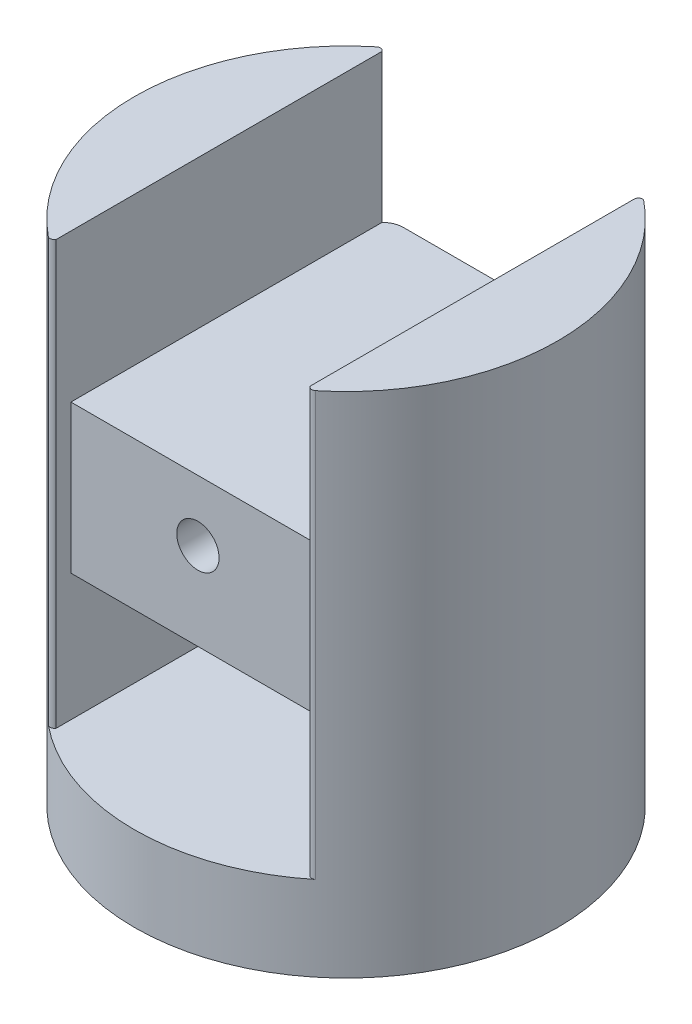
ISO-10303-21;
HEADER;
FILE_DESCRIPTION(('STEP AP214'),'2;1');
FILE_NAME('part.step','',(''),(''),'','','');
FILE_SCHEMA(('AUTOMOTIVE_DESIGN { 1 0 10303 214 1 1 1 1 }'));
ENDSEC;
DATA;
#1=APPLICATION_CONTEXT('core data for automotive mechanical design processes');
#2=APPLICATION_PROTOCOL_DEFINITION('international standard','automotive_design',2000,#1);
#3=PRODUCT_CONTEXT('',#1,'mechanical');
#4=PRODUCT('Part','Part','',(#3));
#5=PRODUCT_RELATED_PRODUCT_CATEGORY('part','',(#4));
#6=PRODUCT_DEFINITION_FORMATION('','',#4);
#7=PRODUCT_DEFINITION_CONTEXT('part definition',#1,'design');
#8=PRODUCT_DEFINITION('design','',#6,#7);
#9=PRODUCT_DEFINITION_SHAPE('','',#8);
#10=(LENGTH_UNIT() NAMED_UNIT(*) SI_UNIT(.MILLI.,.METRE.));
#11=(NAMED_UNIT(*) PLANE_ANGLE_UNIT() SI_UNIT($,.RADIAN.));
#12=(NAMED_UNIT(*) SI_UNIT($,.STERADIAN.) SOLID_ANGLE_UNIT());
#13=UNCERTAINTY_MEASURE_WITH_UNIT(LENGTH_MEASURE(1.E-05),#10,'distance_accuracy_value','');
#14=(GEOMETRIC_REPRESENTATION_CONTEXT(3) GLOBAL_UNCERTAINTY_ASSIGNED_CONTEXT((#13)) GLOBAL_UNIT_ASSIGNED_CONTEXT((#10,
#11,#12)) REPRESENTATION_CONTEXT('',''));
#15=CARTESIAN_POINT('',(0.,0.,0.));
#16=DIRECTION('',(0.,0.,1.));
#17=DIRECTION('',(1.,0.,0.));
#18=AXIS2_PLACEMENT_3D('',#15,#16,#17);
#19=CARTESIAN_POINT('',(-6.,24.,-7.7));
#20=DIRECTION('',(-1.,0.,0.));
#21=DIRECTION('',(0.,0.,1.));
#22=AXIS2_PLACEMENT_3D('',#19,#20,#21);
#23=PLANE('',#22);
#24=DIRECTION('',(0.,0.,-1.));
#25=VECTOR('',#24,1.);
#26=CARTESIAN_POINT('',(-6.,10.,7.));
#27=LINE('',#26,#25);
#28=CARTESIAN_POINT('',(-6.,10.,7.));
#29=VERTEX_POINT('',#28);
#30=CARTESIAN_POINT('',(-6.,10.,-7.69999999999999));
#31=VERTEX_POINT('',#30);
#32=EDGE_CURVE('E341',#29,#31,#27,.T.);
#33=ORIENTED_EDGE('',*,*,#32,.F.);
#34=DIRECTION('',(0.,-1.,0.));
#35=VECTOR('',#34,1.);
#36=CARTESIAN_POINT('',(-6.,17.,7.));
#37=LINE('',#36,#35);
#38=CARTESIAN_POINT('',(-6.,17.,7.));
#39=VERTEX_POINT('',#38);
#40=EDGE_CURVE('E154',#39,#29,#37,.T.);
#41=ORIENTED_EDGE('',*,*,#40,.F.);
#42=DIRECTION('',(0.,0.,1.));
#43=VECTOR('',#42,1.);
#44=CARTESIAN_POINT('',(-6.,17.,7.));
#45=LINE('',#44,#43);
#46=CARTESIAN_POINT('',(-6.,17.,-7.7));
#47=VERTEX_POINT('',#46);
#48=EDGE_CURVE('E171',#47,#39,#45,.T.);
#49=ORIENTED_EDGE('',*,*,#48,.F.);
#50=DIRECTION('',(0.,-1.,0.));
#51=VECTOR('',#50,1.);
#52=CARTESIAN_POINT('',(-6.,24.,-7.7));
#53=LINE('',#52,#51);
#54=CARTESIAN_POINT('',(-6.,24.,-7.7));
#55=VERTEX_POINT('',#54);
#56=EDGE_CURVE('E228',#55,#47,#53,.T.);
#57=ORIENTED_EDGE('',*,*,#56,.F.);
#58=DIRECTION('',(0.,0.,-1.));
#59=VECTOR('',#58,1.);
#60=CARTESIAN_POINT('',(-6.,24.,-7.7));
#61=LINE('',#60,#59);
#62=CARTESIAN_POINT('',(-6.,24.,7.7));
#63=VERTEX_POINT('',#62);
#64=EDGE_CURVE('E218',#63,#55,#61,.T.);
#65=ORIENTED_EDGE('',*,*,#64,.F.);
#66=DIRECTION('',(0.,-1.,0.));
#67=VECTOR('',#66,1.);
#68=CARTESIAN_POINT('',(-6.,24.,7.7));
#69=LINE('',#68,#67);
#70=CARTESIAN_POINT('',(-6.,4.,7.7));
#71=VERTEX_POINT('',#70);
#72=EDGE_CURVE('E231',#63,#71,#69,.T.);
#73=ORIENTED_EDGE('',*,*,#72,.T.);
#74=DIRECTION('',(0.,0.,-1.));
#75=VECTOR('',#74,1.);
#76=CARTESIAN_POINT('',(-6.,4.,-7.7));
#77=LINE('',#76,#75);
#78=CARTESIAN_POINT('',(-6.,4.,-7.7));
#79=VERTEX_POINT('',#78);
#80=EDGE_CURVE('E214',#71,#79,#77,.T.);
#81=ORIENTED_EDGE('',*,*,#80,.T.);
#82=EDGE_CURVE('E220',#31,#79,#53,.T.);
#83=ORIENTED_EDGE('',*,*,#82,.F.);
#84=EDGE_LOOP('',(#33,#41,#49,#57,#65,#73,#81,#83));
#85=FACE_BOUND('',#84,.T.);
#86=ADVANCED_FACE('F37',(#85),#23,.F.);
#87=CARTESIAN_POINT('',(6.21370462181772,24.,-7.60398190115382));
#88=DIRECTION('',(0.,-1.,0.));
#89=DIRECTION('',(0.,0.,-1.));
#90=AXIS2_PLACEMENT_3D('',#87,#88,#89);
#91=CYLINDRICAL_SURFACE('',#90,0.213741715448937);
#92=CARTESIAN_POINT('',(6.21370462181772,10.,-7.60398190115382));
#93=DIRECTION('',(0.,-1.,0.));
#94=DIRECTION('',(0.,0.,-1.));
#95=AXIS2_PLACEMENT_3D('',#92,#93,#94);
#96=CIRCLE('',#95,0.213741715448937);
#97=CARTESIAN_POINT('',(6.,10.,-7.60796380230771));
#98=VERTEX_POINT('',#97);
#99=CARTESIAN_POINT('',(6.,10.,-7.59999999999996));
#100=VERTEX_POINT('',#99);
#101=EDGE_CURVE('E165',#98,#100,#96,.F.);
#102=ORIENTED_EDGE('',*,*,#101,.F.);
#103=DIRECTION('',(0.,-1.,0.));
#104=VECTOR('',#103,1.);
#105=CARTESIAN_POINT('',(6.,24.,-7.60796380230762));
#106=LINE('',#105,#104);
#107=CARTESIAN_POINT('',(6.,17.,-7.60796380230762));
#108=VERTEX_POINT('',#107);
#109=EDGE_CURVE('E245',#108,#98,#106,.T.);
#110=ORIENTED_EDGE('',*,*,#109,.F.);
#111=CARTESIAN_POINT('',(6.21370462181772,17.,-7.60398190115382));
#112=DIRECTION('',(0.,-1.,0.));
#113=DIRECTION('',(0.,0.,-1.));
#114=AXIS2_PLACEMENT_3D('',#111,#112,#113);
#115=CIRCLE('',#114,0.213741715448937);
#116=CARTESIAN_POINT('',(6.,17.,-7.60000000000001));
#117=VERTEX_POINT('',#116);
#118=EDGE_CURVE('E181',#117,#108,#115,.T.);
#119=ORIENTED_EDGE('',*,*,#118,.F.);
#120=DIRECTION('',(0.,-1.,0.));
#121=VECTOR('',#120,1.);
#122=CARTESIAN_POINT('',(6.,24.,-7.6));
#123=LINE('',#122,#121);
#124=CARTESIAN_POINT('',(6.,24.,-7.6));
#125=VERTEX_POINT('',#124);
#126=EDGE_CURVE('E203',#125,#117,#123,.T.);
#127=ORIENTED_EDGE('',*,*,#126,.F.);
#128=CARTESIAN_POINT('',(6.21370462181772,24.,-7.60398190115382));
#129=DIRECTION('',(0.,1.,0.));
#130=DIRECTION('',(0.,0.,-1.));
#131=AXIS2_PLACEMENT_3D('',#128,#129,#130);
#132=CIRCLE('',#131,0.213741715448937);
#133=CARTESIAN_POINT('',(6.23727299848108,24.,-7.81642025113919));
#134=VERTEX_POINT('',#133);
#135=EDGE_CURVE('E188',#134,#125,#132,.T.);
#136=ORIENTED_EDGE('',*,*,#135,.F.);
#137=DIRECTION('',(0.,-1.,0.));
#138=VECTOR('',#137,1.);
#139=CARTESIAN_POINT('',(6.23727299848108,24.,-7.81642025113919));
#140=LINE('',#139,#138);
#141=CARTESIAN_POINT('',(6.23727299848108,4.,-7.81642025113919));
#142=VERTEX_POINT('',#141);
#143=EDGE_CURVE('E205',#134,#142,#140,.T.);
#144=ORIENTED_EDGE('',*,*,#143,.T.);
#145=CARTESIAN_POINT('',(6.21370462181772,4.,-7.60398190115382));
#146=DIRECTION('',(0.,1.,0.));
#147=DIRECTION('',(0.,0.,-1.));
#148=AXIS2_PLACEMENT_3D('',#145,#146,#147);
#149=CIRCLE('',#148,0.213741715448937);
#150=CARTESIAN_POINT('',(6.,4.,-7.6));
#151=VERTEX_POINT('',#150);
#152=EDGE_CURVE('E196',#142,#151,#149,.T.);
#153=ORIENTED_EDGE('',*,*,#152,.T.);
#154=EDGE_CURVE('E202',#100,#151,#123,.T.);
#155=ORIENTED_EDGE('',*,*,#154,.F.);
#156=EDGE_LOOP('',(#102,#110,#119,#127,#136,#144,#153,#155));
#157=FACE_BOUND('',#156,.T.);
#158=ADVANCED_FACE('F299',(#157),#91,.T.);
#159=CARTESIAN_POINT('',(6.,24.,-7.6));
#160=DIRECTION('',(1.,0.,0.));
#161=DIRECTION('',(0.,0.,-1.));
#162=AXIS2_PLACEMENT_3D('',#159,#160,#161);
#163=PLANE('',#162);
#164=DIRECTION('',(0.,-1.,0.));
#165=VECTOR('',#164,1.);
#166=CARTESIAN_POINT('',(6.,17.,7.));
#167=LINE('',#166,#165);
#168=CARTESIAN_POINT('',(6.,17.,7.));
#169=VERTEX_POINT('',#168);
#170=CARTESIAN_POINT('',(6.,10.,7.));
#171=VERTEX_POINT('',#170);
#172=EDGE_CURVE('E144',#169,#171,#167,.T.);
#173=ORIENTED_EDGE('',*,*,#172,.T.);
#174=DIRECTION('',(0.,0.,1.));
#175=VECTOR('',#174,1.);
#176=CARTESIAN_POINT('',(6.,10.,7.));
#177=LINE('',#176,#175);
#178=EDGE_CURVE('E147',#100,#171,#177,.T.);
#179=ORIENTED_EDGE('',*,*,#178,.F.);
#180=ORIENTED_EDGE('',*,*,#154,.T.);
#181=DIRECTION('',(0.,0.,1.));
#182=VECTOR('',#181,1.);
#183=CARTESIAN_POINT('',(6.,4.,-7.6));
#184=LINE('',#183,#182);
#185=CARTESIAN_POINT('',(6.,4.,7.7));
#186=VERTEX_POINT('',#185);
#187=EDGE_CURVE('E186',#151,#186,#184,.T.);
#188=ORIENTED_EDGE('',*,*,#187,.T.);
#189=DIRECTION('',(0.,-1.,0.));
#190=VECTOR('',#189,1.);
#191=CARTESIAN_POINT('',(6.,24.,7.7));
#192=LINE('',#191,#190);
#193=CARTESIAN_POINT('',(6.,24.,7.7));
#194=VERTEX_POINT('',#193);
#195=EDGE_CURVE('E192',#194,#186,#192,.T.);
#196=ORIENTED_EDGE('',*,*,#195,.F.);
#197=DIRECTION('',(0.,0.,1.));
#198=VECTOR('',#197,1.);
#199=CARTESIAN_POINT('',(6.,24.,-7.6));
#200=LINE('',#199,#198);
#201=EDGE_CURVE('E190',#125,#194,#200,.T.);
#202=ORIENTED_EDGE('',*,*,#201,.F.);
#203=ORIENTED_EDGE('',*,*,#126,.T.);
#204=DIRECTION('',(0.,0.,-1.));
#205=VECTOR('',#204,1.);
#206=CARTESIAN_POINT('',(6.,17.,-8.));
#207=LINE('',#206,#205);
#208=EDGE_CURVE('E150',#169,#117,#207,.T.);
#209=ORIENTED_EDGE('',*,*,#208,.F.);
#210=EDGE_LOOP('',(#173,#179,#180,#188,#196,#202,#203,#209));
#211=FACE_BOUND('',#210,.T.);
#212=ADVANCED_FACE('F146',(#211),#163,.F.);
#213=CARTESIAN_POINT('',(0.,4.,0.));
#214=DIRECTION('',(0.,1.,0.));
#215=DIRECTION('',(0.,0.,1.));
#216=AXIS2_PLACEMENT_3D('',#213,#214,#215);
#217=PLANE('',#216);
#218=CARTESIAN_POINT('',(0.,4.,0.));
#219=DIRECTION('',(0.,1.,0.));
#220=DIRECTION('',(0.,0.,1.));
#221=AXIS2_PLACEMENT_3D('',#218,#219,#220);
#222=CIRCLE('',#221,10.);
#223=CARTESIAN_POINT('',(-6.31513599359872,4.,7.75364800480096));
#224=VERTEX_POINT('',#223);
#225=CARTESIAN_POINT('',(6.31513599359872,4.,7.75364800480096));
#226=VERTEX_POINT('',#225);
#227=EDGE_CURVE('E242',#224,#226,#222,.T.);
#228=ORIENTED_EDGE('',*,*,#227,.T.);
#229=CARTESIAN_POINT('',(6.18118610563427,4.,7.58808787936614));
#230=DIRECTION('',(0.,1.,0.));
#231=DIRECTION('',(0.,0.,1.));
#232=AXIS2_PLACEMENT_3D('',#229,#230,#231);
#233=CIRCLE('',#232,0.212961798498422);
#234=EDGE_CURVE('E193',#186,#226,#233,.T.);
#235=ORIENTED_EDGE('',*,*,#234,.F.);
#236=ORIENTED_EDGE('',*,*,#187,.F.);
#237=ORIENTED_EDGE('',*,*,#152,.F.);
#238=CARTESIAN_POINT('',(-6.31513599359872,4.,-7.75364800480096));
#239=VERTEX_POINT('',#238);
#240=EDGE_CURVE('E246',#142,#239,#222,.T.);
#241=ORIENTED_EDGE('',*,*,#240,.T.);
#242=CARTESIAN_POINT('',(-6.18118610563427,4.,-7.58808787936614));
#243=DIRECTION('',(0.,1.,0.));
#244=DIRECTION('',(0.,0.,1.));
#245=AXIS2_PLACEMENT_3D('',#242,#243,#244);
#246=CIRCLE('',#245,0.212961798498421);
#247=EDGE_CURVE('E209',#79,#239,#246,.T.);
#248=ORIENTED_EDGE('',*,*,#247,.F.);
#249=ORIENTED_EDGE('',*,*,#80,.F.);
#250=CARTESIAN_POINT('',(-6.18118610563427,4.,7.58808787936614));
#251=DIRECTION('',(0.,1.,0.));
#252=DIRECTION('',(0.,0.,-1.));
#253=AXIS2_PLACEMENT_3D('',#250,#251,#252);
#254=CIRCLE('',#253,0.212961798498423);
#255=EDGE_CURVE('E223',#224,#71,#254,.T.);
#256=ORIENTED_EDGE('',*,*,#255,.F.);
#257=EDGE_LOOP('',(#228,#235,#236,#237,#241,#248,#249,#256));
#258=FACE_BOUND('',#257,.T.);
#259=ADVANCED_FACE('F277',(#258),#217,.T.);
#260=CARTESIAN_POINT('',(0.,4.,0.));
#261=DIRECTION('',(0.,-1.,0.));
#262=DIRECTION('',(0.,0.,-1.));
#263=AXIS2_PLACEMENT_3D('',#260,#261,#262);
#264=CYLINDRICAL_SURFACE('',#263,10.);
#265=ORIENTED_EDGE('',*,*,#227,.F.);
#266=DIRECTION('',(0.,-1.,0.));
#267=VECTOR('',#266,1.);
#268=CARTESIAN_POINT('',(-6.31513599359872,24.,7.75364800480096));
#269=LINE('',#268,#267);
#270=CARTESIAN_POINT('',(-6.31513599359872,24.,7.75364800480096));
#271=VERTEX_POINT('',#270);
#272=EDGE_CURVE('E235',#271,#224,#269,.T.);
#273=ORIENTED_EDGE('',*,*,#272,.F.);
#274=CARTESIAN_POINT('',(0.,24.,0.));
#275=DIRECTION('',(0.,1.,0.));
#276=DIRECTION('',(0.,0.,1.));
#277=AXIS2_PLACEMENT_3D('',#274,#275,#276);
#278=CIRCLE('',#277,10.);
#279=CARTESIAN_POINT('',(-6.31513599359872,24.,-7.75364800480096));
#280=VERTEX_POINT('',#279);
#281=EDGE_CURVE('E213',#280,#271,#278,.T.);
#282=ORIENTED_EDGE('',*,*,#281,.F.);
#283=DIRECTION('',(0.,-1.,0.));
#284=VECTOR('',#283,1.);
#285=CARTESIAN_POINT('',(-6.31513599359872,24.,-7.75364800480096));
#286=LINE('',#285,#284);
#287=EDGE_CURVE('E238',#280,#239,#286,.T.);
#288=ORIENTED_EDGE('',*,*,#287,.T.);
#289=ORIENTED_EDGE('',*,*,#240,.F.);
#290=ORIENTED_EDGE('',*,*,#143,.F.);
#291=CARTESIAN_POINT('',(0.,24.,0.));
#292=DIRECTION('',(0.,1.,0.));
#293=DIRECTION('',(0.,0.,1.));
#294=AXIS2_PLACEMENT_3D('',#291,#292,#293);
#295=CIRCLE('',#294,10.);
#296=CARTESIAN_POINT('',(6.31513599359872,24.,7.75364800480096));
#297=VERTEX_POINT('',#296);
#298=EDGE_CURVE('E185',#297,#134,#295,.T.);
#299=ORIENTED_EDGE('',*,*,#298,.F.);
#300=DIRECTION('',(0.,-1.,0.));
#301=VECTOR('',#300,1.);
#302=CARTESIAN_POINT('',(6.31513599359872,24.,7.75364800480096));
#303=LINE('',#302,#301);
#304=EDGE_CURVE('E207',#297,#226,#303,.T.);
#305=ORIENTED_EDGE('',*,*,#304,.T.);
#306=EDGE_LOOP('',(#265,#273,#282,#288,#289,#290,#299,#305));
#307=FACE_BOUND('',#306,.T.);
#308=CARTESIAN_POINT('',(0.,0.,0.));
#309=DIRECTION('',(0.,1.,0.));
#310=DIRECTION('',(0.,0.,1.));
#311=AXIS2_PLACEMENT_3D('',#308,#309,#310);
#312=CIRCLE('',#311,10.);
#313=CARTESIAN_POINT('',(0.,0.,10.));
#314=VERTEX_POINT('',#313);
#315=EDGE_CURVE('E241',#314,#314,#312,.T.);
#316=ORIENTED_EDGE('',*,*,#315,.T.);
#317=EDGE_LOOP('',(#316));
#318=FACE_BOUND('',#317,.T.);
#319=ADVANCED_FACE('F288',(#307,#318),#264,.T.);
#320=CARTESIAN_POINT('',(0.,0.,0.));
#321=DIRECTION('',(0.,1.,0.));
#322=DIRECTION('',(0.,0.,1.));
#323=AXIS2_PLACEMENT_3D('',#320,#321,#322);
#324=PLANE('',#323);
#325=ORIENTED_EDGE('',*,*,#315,.F.);
#326=EDGE_LOOP('',(#325));
#327=FACE_BOUND('',#326,.T.);
#328=ADVANCED_FACE('F322',(#327),#324,.F.);
#329=CARTESIAN_POINT('',(-6.18118610563427,24.,-7.58808787936614));
#330=DIRECTION('',(0.,-1.,0.));
#331=DIRECTION('',(0.,0.,-1.));
#332=AXIS2_PLACEMENT_3D('',#329,#330,#331);
#333=CYLINDRICAL_SURFACE('',#332,0.212961798498421);
#334=ORIENTED_EDGE('',*,*,#247,.T.);
#335=ORIENTED_EDGE('',*,*,#287,.F.);
#336=CARTESIAN_POINT('',(-6.18118610563427,24.,-7.58808787936614));
#337=DIRECTION('',(0.,1.,0.));
#338=DIRECTION('',(0.,0.,1.));
#339=AXIS2_PLACEMENT_3D('',#336,#337,#338);
#340=CIRCLE('',#339,0.212961798498421);
#341=EDGE_CURVE('E210',#55,#280,#340,.T.);
#342=ORIENTED_EDGE('',*,*,#341,.F.);
#343=ORIENTED_EDGE('',*,*,#56,.T.);
#344=EDGE_CURVE('E232',#47,#31,#53,.T.);
#345=ORIENTED_EDGE('',*,*,#344,.T.);
#346=ORIENTED_EDGE('',*,*,#82,.T.);
#347=EDGE_LOOP('',(#334,#335,#342,#343,#345,#346));
#348=FACE_BOUND('',#347,.T.);
#349=ADVANCED_FACE('F272',(#348),#333,.T.);
#350=CARTESIAN_POINT('',(-6.18118610563427,24.,7.58808787936614));
#351=DIRECTION('',(0.,-1.,0.));
#352=DIRECTION('',(0.,0.,-1.));
#353=AXIS2_PLACEMENT_3D('',#350,#351,#352);
#354=CYLINDRICAL_SURFACE('',#353,0.212961798498423);
#355=ORIENTED_EDGE('',*,*,#255,.T.);
#356=ORIENTED_EDGE('',*,*,#72,.F.);
#357=CARTESIAN_POINT('',(-6.18118610563427,24.,7.58808787936614));
#358=DIRECTION('',(0.,1.,0.));
#359=DIRECTION('',(0.,0.,-1.));
#360=AXIS2_PLACEMENT_3D('',#357,#358,#359);
#361=CIRCLE('',#360,0.212961798498423);
#362=EDGE_CURVE('E216',#271,#63,#361,.T.);
#363=ORIENTED_EDGE('',*,*,#362,.F.);
#364=ORIENTED_EDGE('',*,*,#272,.T.);
#365=EDGE_LOOP('',(#355,#356,#363,#364));
#366=FACE_BOUND('',#365,.T.);
#367=ADVANCED_FACE('F283',(#366),#354,.T.);
#368=CARTESIAN_POINT('',(-6.18118610563427,24.,-7.58808787936614));
#369=DIRECTION('',(0.,1.,0.));
#370=DIRECTION('',(0.,0.,1.));
#371=AXIS2_PLACEMENT_3D('',#368,#369,#370);
#372=PLANE('',#371);
#373=ORIENTED_EDGE('',*,*,#341,.T.);
#374=ORIENTED_EDGE('',*,*,#281,.T.);
#375=ORIENTED_EDGE('',*,*,#362,.T.);
#376=ORIENTED_EDGE('',*,*,#64,.T.);
#377=EDGE_LOOP('',(#373,#374,#375,#376));
#378=FACE_BOUND('',#377,.T.);
#379=ADVANCED_FACE('F303',(#378),#372,.T.);
#380=CARTESIAN_POINT('',(6.18118610563427,24.,7.58808787936614));
#381=DIRECTION('',(0.,-1.,0.));
#382=DIRECTION('',(0.,0.,-1.));
#383=AXIS2_PLACEMENT_3D('',#380,#381,#382);
#384=CYLINDRICAL_SURFACE('',#383,0.212961798498422);
#385=ORIENTED_EDGE('',*,*,#234,.T.);
#386=ORIENTED_EDGE('',*,*,#304,.F.);
#387=CARTESIAN_POINT('',(6.18118610563427,24.,7.58808787936614));
#388=DIRECTION('',(0.,1.,0.));
#389=DIRECTION('',(0.,0.,1.));
#390=AXIS2_PLACEMENT_3D('',#387,#388,#389);
#391=CIRCLE('',#390,0.212961798498422);
#392=EDGE_CURVE('E182',#194,#297,#391,.T.);
#393=ORIENTED_EDGE('',*,*,#392,.F.);
#394=ORIENTED_EDGE('',*,*,#195,.T.);
#395=EDGE_LOOP('',(#385,#386,#393,#394));
#396=FACE_BOUND('',#395,.T.);
#397=ADVANCED_FACE('F294',(#396),#384,.T.);
#398=CARTESIAN_POINT('',(6.18118610563427,24.,7.58808787936614));
#399=DIRECTION('',(0.,1.,0.));
#400=DIRECTION('',(0.,0.,1.));
#401=AXIS2_PLACEMENT_3D('',#398,#399,#400);
#402=PLANE('',#401);
#403=ORIENTED_EDGE('',*,*,#392,.T.);
#404=ORIENTED_EDGE('',*,*,#298,.T.);
#405=ORIENTED_EDGE('',*,*,#135,.T.);
#406=ORIENTED_EDGE('',*,*,#201,.T.);
#407=EDGE_LOOP('',(#403,#404,#405,#406));
#408=FACE_BOUND('',#407,.T.);
#409=ADVANCED_FACE('F310',(#408),#402,.T.);
#410=CARTESIAN_POINT('',(0.,17.,0.));
#411=DIRECTION('',(0.,-1.,0.));
#412=DIRECTION('',(0.,0.,-1.));
#413=AXIS2_PLACEMENT_3D('',#410,#411,#412);
#414=PLANE('',#413);
#415=ORIENTED_EDGE('',*,*,#118,.T.);
#416=CARTESIAN_POINT('',(5.20603525576783,17.,-7.));
#417=DIRECTION('',(0.,-1.,0.));
#418=DIRECTION('',(0.,0.,-1.));
#419=AXIS2_PLACEMENT_3D('',#416,#417,#418);
#420=CIRCLE('',#419,1.);
#421=CARTESIAN_POINT('',(5.20603525576783,17.,-8.));
#422=VERTEX_POINT('',#421);
#423=EDGE_CURVE('E11',#108,#422,#420,.F.);
#424=ORIENTED_EDGE('',*,*,#423,.T.);
#425=DIRECTION('',(-1.,0.,0.));
#426=VECTOR('',#425,1.);
#427=CARTESIAN_POINT('',(-6.,17.,-8.));
#428=LINE('',#427,#426);
#429=CARTESIAN_POINT('',(-5.28585715714571,17.,-8.));
#430=VERTEX_POINT('',#429);
#431=EDGE_CURVE('E155',#422,#430,#428,.T.);
#432=ORIENTED_EDGE('',*,*,#431,.T.);
#433=CARTESIAN_POINT('',(-5.28585715714571,17.,-7.));
#434=DIRECTION('',(0.,-1.,0.));
#435=DIRECTION('',(0.,0.,-1.));
#436=AXIS2_PLACEMENT_3D('',#433,#434,#435);
#437=CIRCLE('',#436,1.);
#438=EDGE_CURVE('E45',#430,#47,#437,.F.);
#439=ORIENTED_EDGE('',*,*,#438,.T.);
#440=ORIENTED_EDGE('',*,*,#48,.T.);
#441=DIRECTION('',(1.,0.,0.));
#442=VECTOR('',#441,1.);
#443=CARTESIAN_POINT('',(6.,17.,7.));
#444=LINE('',#443,#442);
#445=EDGE_CURVE('E176',#39,#169,#444,.T.);
#446=ORIENTED_EDGE('',*,*,#445,.T.);
#447=ORIENTED_EDGE('',*,*,#208,.T.);
#448=EDGE_LOOP('',(#415,#424,#432,#439,#440,#446,#447));
#449=FACE_BOUND('',#448,.T.);
#450=ADVANCED_FACE('F263',(#449),#414,.F.);
#451=CARTESIAN_POINT('',(6.,17.,7.));
#452=DIRECTION('',(0.,0.,-1.));
#453=DIRECTION('',(-1.,0.,0.));
#454=AXIS2_PLACEMENT_3D('',#451,#452,#453);
#455=PLANE('',#454);
#456=CARTESIAN_POINT('',(0.,14.12,7.));
#457=DIRECTION('',(0.,0.,1.));
#458=DIRECTION('',(-1.,0.,0.));
#459=AXIS2_PLACEMENT_3D('',#456,#457,#458);
#460=CIRCLE('',#459,1.);
#461=CARTESIAN_POINT('',(-0.999999999999999,14.12,7.));
#462=VERTEX_POINT('',#461);
#463=EDGE_CURVE('E347',#462,#462,#460,.T.);
#464=ORIENTED_EDGE('',*,*,#463,.F.);
#465=EDGE_LOOP('',(#464));
#466=FACE_BOUND('',#465,.T.);
#467=ORIENTED_EDGE('',*,*,#40,.T.);
#468=DIRECTION('',(-1.,0.,0.));
#469=VECTOR('',#468,1.);
#470=CARTESIAN_POINT('',(-6.,10.,7.));
#471=LINE('',#470,#469);
#472=EDGE_CURVE('E162',#171,#29,#471,.T.);
#473=ORIENTED_EDGE('',*,*,#472,.F.);
#474=ORIENTED_EDGE('',*,*,#172,.F.);
#475=ORIENTED_EDGE('',*,*,#445,.F.);
#476=EDGE_LOOP('',(#467,#473,#474,#475));
#477=FACE_BOUND('',#476,.T.);
#478=ADVANCED_FACE('F168',(#466,#477),#455,.F.);
#479=CARTESIAN_POINT('',(-6.,17.,-8.));
#480=DIRECTION('',(0.,0.,1.));
#481=DIRECTION('',(1.,0.,0.));
#482=AXIS2_PLACEMENT_3D('',#479,#480,#481);
#483=PLANE('',#482);
#484=CARTESIAN_POINT('',(0.,14.12,-8.));
#485=DIRECTION('',(0.,0.,1.));
#486=DIRECTION('',(1.,0.,0.));
#487=AXIS2_PLACEMENT_3D('',#484,#485,#486);
#488=CIRCLE('',#487,1.);
#489=CARTESIAN_POINT('',(1.,14.12,-8.));
#490=VERTEX_POINT('',#489);
#491=EDGE_CURVE('E342',#490,#490,#488,.F.);
#492=ORIENTED_EDGE('',*,*,#491,.F.);
#493=EDGE_LOOP('',(#492));
#494=FACE_BOUND('',#493,.T.);
#495=ORIENTED_EDGE('',*,*,#431,.F.);
#496=DIRECTION('',(0.,-1.,0.));
#497=VECTOR('',#496,1.);
#498=CARTESIAN_POINT('',(5.20603525576783,17.,-8.));
#499=LINE('',#498,#497);
#500=CARTESIAN_POINT('',(5.20603525576783,10.,-8.));
#501=VERTEX_POINT('',#500);
#502=EDGE_CURVE('E255',#422,#501,#499,.T.);
#503=ORIENTED_EDGE('',*,*,#502,.T.);
#504=DIRECTION('',(1.,0.,0.));
#505=VECTOR('',#504,1.);
#506=CARTESIAN_POINT('',(-6.,10.,-8.));
#507=LINE('',#506,#505);
#508=CARTESIAN_POINT('',(-5.28585715714571,10.,-8.));
#509=VERTEX_POINT('',#508);
#510=EDGE_CURVE('E166',#509,#501,#507,.T.);
#511=ORIENTED_EDGE('',*,*,#510,.F.);
#512=DIRECTION('',(0.,-1.,0.));
#513=VECTOR('',#512,1.);
#514=CARTESIAN_POINT('',(-5.28585715714571,17.,-8.));
#515=LINE('',#514,#513);
#516=EDGE_CURVE('E52',#509,#430,#515,.F.);
#517=ORIENTED_EDGE('',*,*,#516,.T.);
#518=EDGE_LOOP('',(#495,#503,#511,#517));
#519=FACE_BOUND('',#518,.T.);
#520=ADVANCED_FACE('F337',(#494,#519),#483,.F.);
#521=CARTESIAN_POINT('',(0.,10.,0.));
#522=DIRECTION('',(0.,-1.,0.));
#523=DIRECTION('',(0.,0.,-1.));
#524=AXIS2_PLACEMENT_3D('',#521,#522,#523);
#525=PLANE('',#524);
#526=ORIENTED_EDGE('',*,*,#510,.T.);
#527=CARTESIAN_POINT('',(5.20603525576783,10.,-7.));
#528=DIRECTION('',(0.,-1.,0.));
#529=DIRECTION('',(0.,0.,-1.));
#530=AXIS2_PLACEMENT_3D('',#527,#528,#529);
#531=CIRCLE('',#530,1.);
#532=EDGE_CURVE('E260',#501,#98,#531,.T.);
#533=ORIENTED_EDGE('',*,*,#532,.T.);
#534=ORIENTED_EDGE('',*,*,#101,.T.);
#535=ORIENTED_EDGE('',*,*,#178,.T.);
#536=ORIENTED_EDGE('',*,*,#472,.T.);
#537=ORIENTED_EDGE('',*,*,#32,.T.);
#538=CARTESIAN_POINT('',(-5.28585715714571,10.,-7.));
#539=DIRECTION('',(0.,-1.,0.));
#540=DIRECTION('',(0.,0.,-1.));
#541=AXIS2_PLACEMENT_3D('',#538,#539,#540);
#542=CIRCLE('',#541,1.);
#543=EDGE_CURVE('E258',#31,#509,#542,.T.);
#544=ORIENTED_EDGE('',*,*,#543,.T.);
#545=EDGE_LOOP('',(#526,#533,#534,#535,#536,#537,#544));
#546=FACE_BOUND('',#545,.T.);
#547=ADVANCED_FACE('F160',(#546),#525,.T.);
#548=CARTESIAN_POINT('',(5.20603525576783,24.,-7.));
#549=DIRECTION('',(0.,-1.,0.));
#550=DIRECTION('',(0.,0.,-1.));
#551=AXIS2_PLACEMENT_3D('',#548,#549,#550);
#552=CYLINDRICAL_SURFACE('',#551,1.);
#553=ORIENTED_EDGE('',*,*,#423,.F.);
#554=ORIENTED_EDGE('',*,*,#109,.T.);
#555=ORIENTED_EDGE('',*,*,#532,.F.);
#556=ORIENTED_EDGE('',*,*,#502,.F.);
#557=EDGE_LOOP('',(#553,#554,#555,#556));
#558=FACE_BOUND('',#557,.T.);
#559=ADVANCED_FACE('F329',(#558),#552,.T.);
#560=CARTESIAN_POINT('',(-5.28585715714571,24.,-7.));
#561=DIRECTION('',(0.,-1.,0.));
#562=DIRECTION('',(0.,0.,-1.));
#563=AXIS2_PLACEMENT_3D('',#560,#561,#562);
#564=CYLINDRICAL_SURFACE('',#563,1.);
#565=ORIENTED_EDGE('',*,*,#438,.F.);
#566=ORIENTED_EDGE('',*,*,#516,.F.);
#567=ORIENTED_EDGE('',*,*,#543,.F.);
#568=ORIENTED_EDGE('',*,*,#344,.F.);
#569=EDGE_LOOP('',(#565,#566,#567,#568));
#570=FACE_BOUND('',#569,.T.);
#571=ADVANCED_FACE('F39',(#570),#564,.T.);
#572=CARTESIAN_POINT('',(0.,14.12,-10.001));
#573=DIRECTION('',(0.,0.,1.));
#574=DIRECTION('',(1.,0.,0.));
#575=AXIS2_PLACEMENT_3D('',#572,#573,#574);
#576=CYLINDRICAL_SURFACE('',#575,1.);
#577=ORIENTED_EDGE('',*,*,#463,.T.);
#578=EDGE_LOOP('',(#577));
#579=FACE_BOUND('',#578,.T.);
#580=ORIENTED_EDGE('',*,*,#491,.T.);
#581=EDGE_LOOP('',(#580));
#582=FACE_BOUND('',#581,.T.);
#583=ADVANCED_FACE('F336',(#579,#582),#576,.F.);
#584=CLOSED_SHELL('',(#86,#158,#212,#259,#319,#328,#349,#367,#379,#397,#409,#450,#478,#520,#547,
#559,#571,#583));
#585=MANIFOLD_SOLID_BREP('B2',#584);
#586=ADVANCED_BREP_SHAPE_REPRESENTATION('',(#18,#585),#14);
#587=SHAPE_DEFINITION_REPRESENTATION(#9,#586);
ENDSEC;
END-ISO-10303-21;
